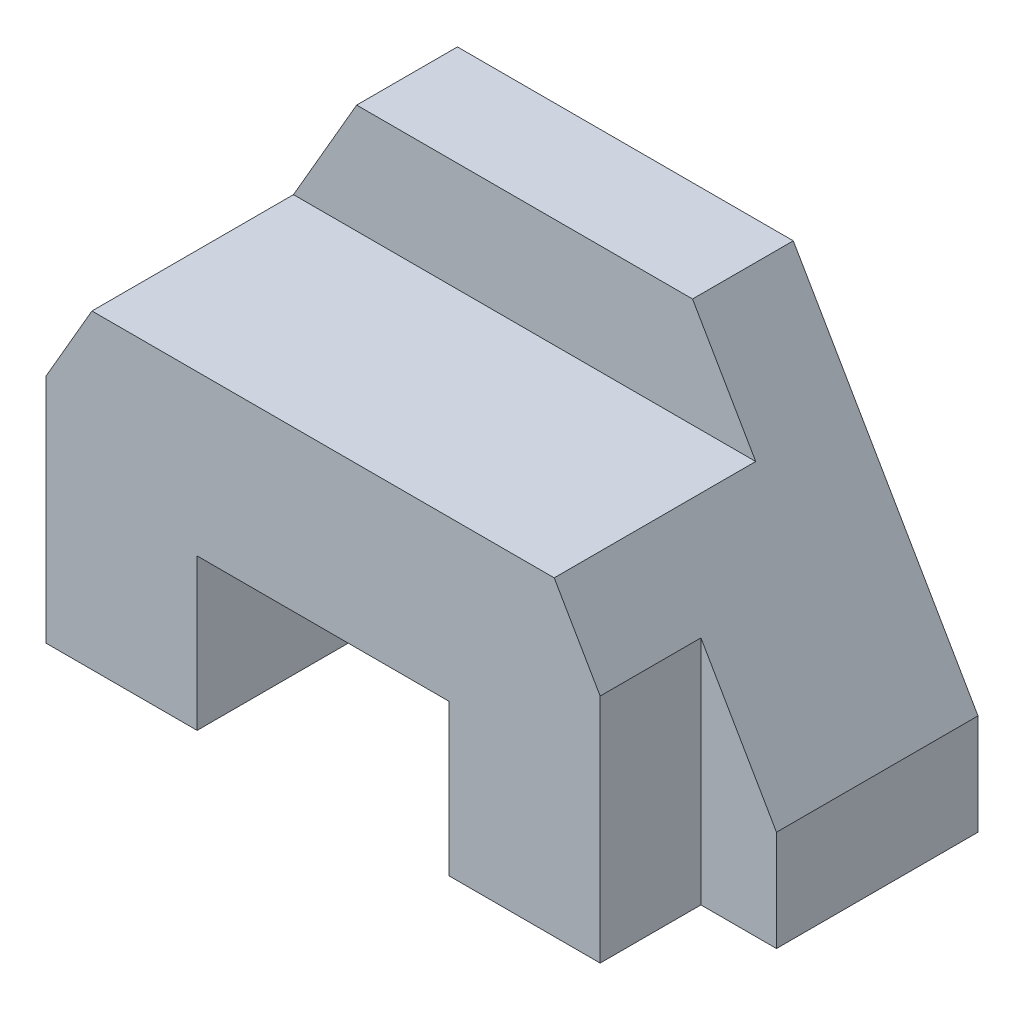
ISO-10303-21;
HEADER;
FILE_DESCRIPTION(('STEP AP214'),'2;1');
FILE_NAME('part.step','',(''),(''),'','','');
FILE_SCHEMA(('AUTOMOTIVE_DESIGN { 1 0 10303 214 1 1 1 1 }'));
ENDSEC;
DATA;
#1=APPLICATION_CONTEXT('core data for automotive mechanical design processes');
#2=APPLICATION_PROTOCOL_DEFINITION('international standard','automotive_design',2000,#1);
#3=PRODUCT_CONTEXT('',#1,'mechanical');
#4=PRODUCT('Part','Part','',(#3));
#5=PRODUCT_RELATED_PRODUCT_CATEGORY('part','',(#4));
#6=PRODUCT_DEFINITION_FORMATION('','',#4);
#7=PRODUCT_DEFINITION_CONTEXT('part definition',#1,'design');
#8=PRODUCT_DEFINITION('design','',#6,#7);
#9=PRODUCT_DEFINITION_SHAPE('','',#8);
#10=(LENGTH_UNIT() NAMED_UNIT(*) SI_UNIT(.MILLI.,.METRE.));
#11=(NAMED_UNIT(*) PLANE_ANGLE_UNIT() SI_UNIT($,.RADIAN.));
#12=(NAMED_UNIT(*) SI_UNIT($,.STERADIAN.) SOLID_ANGLE_UNIT());
#13=UNCERTAINTY_MEASURE_WITH_UNIT(LENGTH_MEASURE(1.E-05),#10,'distance_accuracy_value','');
#14=(GEOMETRIC_REPRESENTATION_CONTEXT(3) GLOBAL_UNCERTAINTY_ASSIGNED_CONTEXT((#13)) GLOBAL_UNIT_ASSIGNED_CONTEXT((#10,
#11,#12)) REPRESENTATION_CONTEXT('',''));
#15=CARTESIAN_POINT('',(0.,0.,0.));
#16=DIRECTION('',(0.,0.,1.));
#17=DIRECTION('',(1.,0.,0.));
#18=AXIS2_PLACEMENT_3D('',#15,#16,#17);
#19=CARTESIAN_POINT('',(-1066.8,0.,-914.4));
#20=DIRECTION('',(0.,-1.,0.));
#21=DIRECTION('',(0.,0.,-1.));
#22=AXIS2_PLACEMENT_3D('',#19,#20,#21);
#23=PLANE('',#22);
#24=DIRECTION('',(1.,0.,0.));
#25=VECTOR('',#24,1.);
#26=CARTESIAN_POINT('',(-1066.8,0.,0.));
#27=LINE('',#26,#25);
#28=CARTESIAN_POINT('',(-838.2,0.,0.));
#29=VERTEX_POINT('',#28);
#30=CARTESIAN_POINT('',(-381.,0.,0.));
#31=VERTEX_POINT('',#30);
#32=EDGE_CURVE('E244',#29,#31,#27,.T.);
#33=ORIENTED_EDGE('',*,*,#32,.F.);
#34=DIRECTION('',(0.,0.,-1.));
#35=VECTOR('',#34,1.);
#36=CARTESIAN_POINT('',(-838.2,0.,-304.8));
#37=LINE('',#36,#35);
#38=CARTESIAN_POINT('',(-838.2,0.,-304.8));
#39=VERTEX_POINT('',#38);
#40=EDGE_CURVE('E226',#29,#39,#37,.T.);
#41=ORIENTED_EDGE('',*,*,#40,.T.);
#42=DIRECTION('',(-1.,0.,0.));
#43=VECTOR('',#42,1.);
#44=CARTESIAN_POINT('',(-1066.8,0.,-304.8));
#45=LINE('',#44,#43);
#46=CARTESIAN_POINT('',(-1066.8,0.,-304.8));
#47=VERTEX_POINT('',#46);
#48=EDGE_CURVE('E223',#39,#47,#45,.T.);
#49=ORIENTED_EDGE('',*,*,#48,.T.);
#50=DIRECTION('',(0.,0.,1.));
#51=VECTOR('',#50,1.);
#52=CARTESIAN_POINT('',(-1066.8,0.,-914.4));
#53=LINE('',#52,#51);
#54=CARTESIAN_POINT('',(-1066.8,0.,-914.4));
#55=VERTEX_POINT('',#54);
#56=EDGE_CURVE('E180',#55,#47,#53,.T.);
#57=ORIENTED_EDGE('',*,*,#56,.F.);
#58=DIRECTION('',(1.,0.,0.));
#59=VECTOR('',#58,1.);
#60=CARTESIAN_POINT('',(-1066.8,0.,-914.4));
#61=LINE('',#60,#59);
#62=CARTESIAN_POINT('',(-381.,0.,-914.4));
#63=VERTEX_POINT('',#62);
#64=EDGE_CURVE('E171',#55,#63,#61,.T.);
#65=ORIENTED_EDGE('',*,*,#64,.T.);
#66=DIRECTION('',(0.,0.,1.));
#67=VECTOR('',#66,1.);
#68=CARTESIAN_POINT('',(-381.,0.,-914.4));
#69=LINE('',#68,#67);
#70=EDGE_CURVE('E205',#63,#31,#69,.T.);
#71=ORIENTED_EDGE('',*,*,#70,.T.);
#72=EDGE_LOOP('',(#33,#41,#49,#57,#65,#71));
#73=FACE_BOUND('',#72,.T.);
#74=ADVANCED_FACE('F33',(#73),#23,.T.);
#75=CARTESIAN_POINT('',(-1066.8,304.8,-914.4));
#76=DIRECTION('',(-1.,0.,0.));
#77=DIRECTION('',(0.,-1.,0.));
#78=AXIS2_PLACEMENT_3D('',#75,#76,#77);
#79=PLANE('',#78);
#80=ORIENTED_EDGE('',*,*,#56,.T.);
#81=DIRECTION('',(0.,-1.,0.));
#82=VECTOR('',#81,1.);
#83=CARTESIAN_POINT('',(-1066.8,1270.,-304.8));
#84=LINE('',#83,#82);
#85=CARTESIAN_POINT('',(-1066.8,304.8,-304.8));
#86=VERTEX_POINT('',#85);
#87=EDGE_CURVE('E217',#86,#47,#84,.T.);
#88=ORIENTED_EDGE('',*,*,#87,.F.);
#89=DIRECTION('',(0.,0.,1.));
#90=VECTOR('',#89,1.);
#91=CARTESIAN_POINT('',(-1066.8,304.8,-914.4));
#92=LINE('',#91,#90);
#93=CARTESIAN_POINT('',(-1066.8,304.8,-914.4));
#94=VERTEX_POINT('',#93);
#95=EDGE_CURVE('E184',#94,#86,#92,.T.);
#96=ORIENTED_EDGE('',*,*,#95,.F.);
#97=DIRECTION('',(0.,-1.,0.));
#98=VECTOR('',#97,1.);
#99=CARTESIAN_POINT('',(-1066.8,304.8,-914.4));
#100=LINE('',#99,#98);
#101=EDGE_CURVE('E208',#94,#55,#100,.T.);
#102=ORIENTED_EDGE('',*,*,#101,.T.);
#103=EDGE_LOOP('',(#80,#88,#96,#102));
#104=FACE_BOUND('',#103,.T.);
#105=ADVANCED_FACE('F221',(#104),#79,.T.);
#106=CARTESIAN_POINT('',(-508.,1270.,-914.4));
#107=DIRECTION('',(-0.865426285481126,0.501036270541705,0.));
#108=DIRECTION('',(-0.501036270541705,-0.865426285481126,0.));
#109=AXIS2_PLACEMENT_3D('',#106,#107,#108);
#110=PLANE('',#109);
#111=DIRECTION('',(-0.501036270541705,-0.865426285481126,0.));
#112=VECTOR('',#111,1.);
#113=CARTESIAN_POINT('',(-508.,1270.,-609.6));
#114=LINE('',#113,#112);
#115=CARTESIAN_POINT('',(-508.,1270.,-609.6));
#116=VERTEX_POINT('',#115);
#117=CARTESIAN_POINT('',(-699.168421052632,939.8,-609.6));
#118=VERTEX_POINT('',#117);
#119=EDGE_CURVE('E289',#116,#118,#114,.T.);
#120=ORIENTED_EDGE('',*,*,#119,.F.);
#121=DIRECTION('',(0.,0.,1.));
#122=VECTOR('',#121,1.);
#123=CARTESIAN_POINT('',(-508.,1270.,-914.4));
#124=LINE('',#123,#122);
#125=CARTESIAN_POINT('',(-508.,1270.,-914.4));
#126=VERTEX_POINT('',#125);
#127=EDGE_CURVE('E187',#126,#116,#124,.T.);
#128=ORIENTED_EDGE('',*,*,#127,.F.);
#129=DIRECTION('',(-0.501036270541705,-0.865426285481126,0.));
#130=VECTOR('',#129,1.);
#131=CARTESIAN_POINT('',(-508.,1270.,-914.4));
#132=LINE('',#131,#130);
#133=EDGE_CURVE('E266',#126,#94,#132,.T.);
#134=ORIENTED_EDGE('',*,*,#133,.T.);
#135=ORIENTED_EDGE('',*,*,#95,.T.);
#136=DIRECTION('',(0.501036270541705,0.865426285481126,0.));
#137=VECTOR('',#136,1.);
#138=CARTESIAN_POINT('',(-508.,1270.,-304.8));
#139=LINE('',#138,#137);
#140=CARTESIAN_POINT('',(-838.2,699.654545454546,-304.8));
#141=VERTEX_POINT('',#140);
#142=EDGE_CURVE('E40',#86,#141,#139,.T.);
#143=ORIENTED_EDGE('',*,*,#142,.T.);
#144=DIRECTION('',(0.,0.,1.));
#145=VECTOR('',#144,1.);
#146=CARTESIAN_POINT('',(-838.2,699.654545454546,-914.4));
#147=LINE('',#146,#145);
#148=CARTESIAN_POINT('',(-838.2,699.654545454546,0.));
#149=VERTEX_POINT('',#148);
#150=EDGE_CURVE('E170',#141,#149,#147,.T.);
#151=ORIENTED_EDGE('',*,*,#150,.T.);
#152=DIRECTION('',(-0.501036270541705,-0.865426285481126,0.));
#153=VECTOR('',#152,1.);
#154=CARTESIAN_POINT('',(-508.,1270.,0.));
#155=LINE('',#154,#153);
#156=CARTESIAN_POINT('',(-699.168421052632,939.8,0.));
#157=VERTEX_POINT('',#156);
#158=EDGE_CURVE('E162',#157,#149,#155,.T.);
#159=ORIENTED_EDGE('',*,*,#158,.F.);
#160=DIRECTION('',(0.,0.,1.));
#161=VECTOR('',#160,1.);
#162=CARTESIAN_POINT('',(-699.168421052632,939.8,-914.4));
#163=LINE('',#162,#161);
#164=EDGE_CURVE('E146',#118,#157,#163,.T.);
#165=ORIENTED_EDGE('',*,*,#164,.F.);
#166=EDGE_LOOP('',(#120,#128,#134,#135,#143,#151,#159,#165));
#167=FACE_BOUND('',#166,.T.);
#168=ADVANCED_FACE('F168',(#167),#110,.T.);
#169=CARTESIAN_POINT('',(1066.8,304.8,-914.4));
#170=DIRECTION('',(0.865426285481126,0.501036270541705,0.));
#171=DIRECTION('',(-0.501036270541705,0.865426285481126,0.));
#172=AXIS2_PLACEMENT_3D('',#169,#170,#171);
#173=PLANE('',#172);
#174=DIRECTION('',(-0.501036270541705,0.865426285481126,0.));
#175=VECTOR('',#174,1.);
#176=CARTESIAN_POINT('',(1066.8,304.8,-609.6));
#177=LINE('',#176,#175);
#178=CARTESIAN_POINT('',(699.168421052632,939.8,-609.6));
#179=VERTEX_POINT('',#178);
#180=CARTESIAN_POINT('',(508.,1270.,-609.6));
#181=VERTEX_POINT('',#180);
#182=EDGE_CURVE('E46',#179,#181,#177,.T.);
#183=ORIENTED_EDGE('',*,*,#182,.F.);
#184=DIRECTION('',(0.,0.,-1.));
#185=VECTOR('',#184,1.);
#186=CARTESIAN_POINT('',(699.168421052632,939.8,-914.4));
#187=LINE('',#186,#185);
#188=CARTESIAN_POINT('',(699.168421052632,939.8,0.));
#189=VERTEX_POINT('',#188);
#190=EDGE_CURVE('E156',#189,#179,#187,.T.);
#191=ORIENTED_EDGE('',*,*,#190,.F.);
#192=DIRECTION('',(-0.501036270541705,0.865426285481126,0.));
#193=VECTOR('',#192,1.);
#194=CARTESIAN_POINT('',(1066.8,304.8,0.));
#195=LINE('',#194,#193);
#196=CARTESIAN_POINT('',(838.2,699.654545454546,0.));
#197=VERTEX_POINT('',#196);
#198=EDGE_CURVE('E165',#197,#189,#195,.T.);
#199=ORIENTED_EDGE('',*,*,#198,.F.);
#200=DIRECTION('',(0.,0.,-1.));
#201=VECTOR('',#200,1.);
#202=CARTESIAN_POINT('',(838.2,699.654545454546,-914.4));
#203=LINE('',#202,#201);
#204=CARTESIAN_POINT('',(838.2,699.654545454546,-304.8));
#205=VERTEX_POINT('',#204);
#206=EDGE_CURVE('E54',#197,#205,#203,.T.);
#207=ORIENTED_EDGE('',*,*,#206,.T.);
#208=DIRECTION('',(0.501036270541705,-0.865426285481126,0.));
#209=VECTOR('',#208,1.);
#210=CARTESIAN_POINT('',(1066.8,304.8,-304.8));
#211=LINE('',#210,#209);
#212=CARTESIAN_POINT('',(1066.8,304.8,-304.8));
#213=VERTEX_POINT('',#212);
#214=EDGE_CURVE('E242',#205,#213,#211,.T.);
#215=ORIENTED_EDGE('',*,*,#214,.T.);
#216=DIRECTION('',(0.,0.,1.));
#217=VECTOR('',#216,1.);
#218=CARTESIAN_POINT('',(1066.8,304.8,-914.4));
#219=LINE('',#218,#217);
#220=CARTESIAN_POINT('',(1066.8,304.8,-914.4));
#221=VERTEX_POINT('',#220);
#222=EDGE_CURVE('E193',#221,#213,#219,.T.);
#223=ORIENTED_EDGE('',*,*,#222,.F.);
#224=DIRECTION('',(-0.501036270541705,0.865426285481126,0.));
#225=VECTOR('',#224,1.);
#226=CARTESIAN_POINT('',(1066.8,304.8,-914.4));
#227=LINE('',#226,#225);
#228=CARTESIAN_POINT('',(508.,1270.,-914.4));
#229=VERTEX_POINT('',#228);
#230=EDGE_CURVE('E260',#221,#229,#227,.T.);
#231=ORIENTED_EDGE('',*,*,#230,.T.);
#232=DIRECTION('',(0.,0.,1.));
#233=VECTOR('',#232,1.);
#234=CARTESIAN_POINT('',(508.,1270.,-914.4));
#235=LINE('',#234,#233);
#236=EDGE_CURVE('E190',#229,#181,#235,.T.);
#237=ORIENTED_EDGE('',*,*,#236,.T.);
#238=EDGE_LOOP('',(#183,#191,#199,#207,#215,#223,#231,#237));
#239=FACE_BOUND('',#238,.T.);
#240=ADVANCED_FACE('F288',(#239),#173,.T.);
#241=CARTESIAN_POINT('',(1066.8,0.,-914.4));
#242=DIRECTION('',(1.,0.,0.));
#243=DIRECTION('',(0.,1.,0.));
#244=AXIS2_PLACEMENT_3D('',#241,#242,#243);
#245=PLANE('',#244);
#246=ORIENTED_EDGE('',*,*,#222,.T.);
#247=DIRECTION('',(0.,-1.,0.));
#248=VECTOR('',#247,1.);
#249=CARTESIAN_POINT('',(1066.8,1270.,-304.8));
#250=LINE('',#249,#248);
#251=CARTESIAN_POINT('',(1066.8,0.,-304.8));
#252=VERTEX_POINT('',#251);
#253=EDGE_CURVE('E237',#213,#252,#250,.T.);
#254=ORIENTED_EDGE('',*,*,#253,.T.);
#255=DIRECTION('',(0.,0.,1.));
#256=VECTOR('',#255,1.);
#257=CARTESIAN_POINT('',(1066.8,0.,-914.4));
#258=LINE('',#257,#256);
#259=CARTESIAN_POINT('',(1066.8,0.,-914.4));
#260=VERTEX_POINT('',#259);
#261=EDGE_CURVE('E196',#260,#252,#258,.T.);
#262=ORIENTED_EDGE('',*,*,#261,.F.);
#263=DIRECTION('',(0.,1.,0.));
#264=VECTOR('',#263,1.);
#265=CARTESIAN_POINT('',(1066.8,0.,-914.4));
#266=LINE('',#265,#264);
#267=EDGE_CURVE('E257',#260,#221,#266,.T.);
#268=ORIENTED_EDGE('',*,*,#267,.T.);
#269=EDGE_LOOP('',(#246,#254,#262,#268));
#270=FACE_BOUND('',#269,.T.);
#271=ADVANCED_FACE('F315',(#270),#245,.T.);
#272=CARTESIAN_POINT('',(381.,0.,-914.4));
#273=DIRECTION('',(0.,-1.,0.));
#274=DIRECTION('',(0.,0.,-1.));
#275=AXIS2_PLACEMENT_3D('',#272,#273,#274);
#276=PLANE('',#275);
#277=ORIENTED_EDGE('',*,*,#261,.T.);
#278=DIRECTION('',(-1.,0.,0.));
#279=VECTOR('',#278,1.);
#280=CARTESIAN_POINT('',(1066.8,0.,-304.8));
#281=LINE('',#280,#279);
#282=CARTESIAN_POINT('',(838.2,0.,-304.8));
#283=VERTEX_POINT('',#282);
#284=EDGE_CURVE('E155',#252,#283,#281,.T.);
#285=ORIENTED_EDGE('',*,*,#284,.T.);
#286=DIRECTION('',(0.,0.,1.));
#287=VECTOR('',#286,1.);
#288=CARTESIAN_POINT('',(838.2,0.,-304.8));
#289=LINE('',#288,#287);
#290=CARTESIAN_POINT('',(838.2,0.,0.));
#291=VERTEX_POINT('',#290);
#292=EDGE_CURVE('E232',#283,#291,#289,.T.);
#293=ORIENTED_EDGE('',*,*,#292,.T.);
#294=DIRECTION('',(1.,0.,0.));
#295=VECTOR('',#294,1.);
#296=CARTESIAN_POINT('',(381.,0.,0.));
#297=LINE('',#296,#295);
#298=CARTESIAN_POINT('',(381.,0.,0.));
#299=VERTEX_POINT('',#298);
#300=EDGE_CURVE('E176',#299,#291,#297,.T.);
#301=ORIENTED_EDGE('',*,*,#300,.F.);
#302=DIRECTION('',(0.,0.,1.));
#303=VECTOR('',#302,1.);
#304=CARTESIAN_POINT('',(381.,0.,-914.4));
#305=LINE('',#304,#303);
#306=CARTESIAN_POINT('',(381.,0.,-914.4));
#307=VERTEX_POINT('',#306);
#308=EDGE_CURVE('E199',#307,#299,#305,.T.);
#309=ORIENTED_EDGE('',*,*,#308,.F.);
#310=DIRECTION('',(1.,0.,0.));
#311=VECTOR('',#310,1.);
#312=CARTESIAN_POINT('',(381.,0.,-914.4));
#313=LINE('',#312,#311);
#314=EDGE_CURVE('E254',#307,#260,#313,.T.);
#315=ORIENTED_EDGE('',*,*,#314,.T.);
#316=EDGE_LOOP('',(#277,#285,#293,#301,#309,#315));
#317=FACE_BOUND('',#316,.T.);
#318=ADVANCED_FACE('F282',(#317),#276,.T.);
#319=CARTESIAN_POINT('',(0.,0.,0.));
#320=DIRECTION('',(0.,0.,1.));
#321=DIRECTION('',(1.,0.,0.));
#322=AXIS2_PLACEMENT_3D('',#319,#320,#321);
#323=PLANE('',#322);
#324=DIRECTION('',(1.,0.,0.));
#325=VECTOR('',#324,1.);
#326=CARTESIAN_POINT('',(-1066.8,939.8,0.));
#327=LINE('',#326,#325);
#328=EDGE_CURVE('E149',#157,#189,#327,.T.);
#329=ORIENTED_EDGE('',*,*,#328,.F.);
#330=ORIENTED_EDGE('',*,*,#158,.T.);
#331=DIRECTION('',(0.,-1.,0.));
#332=VECTOR('',#331,1.);
#333=CARTESIAN_POINT('',(-838.2,0.,0.));
#334=LINE('',#333,#332);
#335=EDGE_CURVE('E210',#149,#29,#334,.T.);
#336=ORIENTED_EDGE('',*,*,#335,.T.);
#337=ORIENTED_EDGE('',*,*,#32,.T.);
#338=DIRECTION('',(0.,1.,0.));
#339=VECTOR('',#338,1.);
#340=CARTESIAN_POINT('',(-381.,0.,0.));
#341=LINE('',#340,#339);
#342=CARTESIAN_POINT('',(-381.,457.2,0.));
#343=VERTEX_POINT('',#342);
#344=EDGE_CURVE('E270',#31,#343,#341,.T.);
#345=ORIENTED_EDGE('',*,*,#344,.T.);
#346=DIRECTION('',(1.,0.,0.));
#347=VECTOR('',#346,1.);
#348=CARTESIAN_POINT('',(-381.,457.2,0.));
#349=LINE('',#348,#347);
#350=CARTESIAN_POINT('',(381.,457.2,0.));
#351=VERTEX_POINT('',#350);
#352=EDGE_CURVE('E273',#343,#351,#349,.T.);
#353=ORIENTED_EDGE('',*,*,#352,.T.);
#354=DIRECTION('',(0.,-1.,0.));
#355=VECTOR('',#354,1.);
#356=CARTESIAN_POINT('',(381.,457.2,0.));
#357=LINE('',#356,#355);
#358=EDGE_CURVE('E276',#351,#299,#357,.T.);
#359=ORIENTED_EDGE('',*,*,#358,.T.);
#360=ORIENTED_EDGE('',*,*,#300,.T.);
#361=DIRECTION('',(0.,1.,0.));
#362=VECTOR('',#361,1.);
#363=CARTESIAN_POINT('',(838.2,0.,0.));
#364=LINE('',#363,#362);
#365=EDGE_CURVE('E183',#291,#197,#364,.T.);
#366=ORIENTED_EDGE('',*,*,#365,.T.);
#367=ORIENTED_EDGE('',*,*,#198,.T.);
#368=EDGE_LOOP('',(#329,#330,#336,#337,#345,#353,#359,#360,#366,#367));
#369=FACE_BOUND('',#368,.T.);
#370=ADVANCED_FACE('F160',(#369),#323,.T.);
#371=CARTESIAN_POINT('',(508.,1270.,-914.4));
#372=DIRECTION('',(0.,1.,0.));
#373=DIRECTION('',(0.,0.,1.));
#374=AXIS2_PLACEMENT_3D('',#371,#372,#373);
#375=PLANE('',#374);
#376=DIRECTION('',(-1.,0.,0.));
#377=VECTOR('',#376,1.);
#378=CARTESIAN_POINT('',(508.,1270.,-609.6));
#379=LINE('',#378,#377);
#380=EDGE_CURVE('E11',#181,#116,#379,.T.);
#381=ORIENTED_EDGE('',*,*,#380,.F.);
#382=ORIENTED_EDGE('',*,*,#236,.F.);
#383=DIRECTION('',(-1.,0.,0.));
#384=VECTOR('',#383,1.);
#385=CARTESIAN_POINT('',(508.,1270.,-914.4));
#386=LINE('',#385,#384);
#387=EDGE_CURVE('E263',#229,#126,#386,.T.);
#388=ORIENTED_EDGE('',*,*,#387,.T.);
#389=ORIENTED_EDGE('',*,*,#127,.T.);
#390=EDGE_LOOP('',(#381,#382,#388,#389));
#391=FACE_BOUND('',#390,.T.);
#392=ADVANCED_FACE('F336',(#391),#375,.T.);
#393=CARTESIAN_POINT('',(381.,457.2,-914.4));
#394=DIRECTION('',(-1.,0.,0.));
#395=DIRECTION('',(0.,-1.,0.));
#396=AXIS2_PLACEMENT_3D('',#393,#394,#395);
#397=PLANE('',#396);
#398=ORIENTED_EDGE('',*,*,#358,.F.);
#399=DIRECTION('',(0.,0.,1.));
#400=VECTOR('',#399,1.);
#401=CARTESIAN_POINT('',(381.,457.2,-914.4));
#402=LINE('',#401,#400);
#403=CARTESIAN_POINT('',(381.,457.2,-914.4));
#404=VERTEX_POINT('',#403);
#405=EDGE_CURVE('E201',#404,#351,#402,.T.);
#406=ORIENTED_EDGE('',*,*,#405,.F.);
#407=DIRECTION('',(0.,-1.,0.));
#408=VECTOR('',#407,1.);
#409=CARTESIAN_POINT('',(381.,457.2,-914.4));
#410=LINE('',#409,#408);
#411=EDGE_CURVE('E251',#404,#307,#410,.T.);
#412=ORIENTED_EDGE('',*,*,#411,.T.);
#413=ORIENTED_EDGE('',*,*,#308,.T.);
#414=EDGE_LOOP('',(#398,#406,#412,#413));
#415=FACE_BOUND('',#414,.T.);
#416=ADVANCED_FACE('F309',(#415),#397,.T.);
#417=CARTESIAN_POINT('',(-381.,457.2,-914.4));
#418=DIRECTION('',(0.,-1.,0.));
#419=DIRECTION('',(0.,0.,-1.));
#420=AXIS2_PLACEMENT_3D('',#417,#418,#419);
#421=PLANE('',#420);
#422=ORIENTED_EDGE('',*,*,#352,.F.);
#423=DIRECTION('',(0.,0.,1.));
#424=VECTOR('',#423,1.);
#425=CARTESIAN_POINT('',(-381.,457.2,-914.4));
#426=LINE('',#425,#424);
#427=CARTESIAN_POINT('',(-381.,457.2,-914.4));
#428=VERTEX_POINT('',#427);
#429=EDGE_CURVE('E203',#428,#343,#426,.T.);
#430=ORIENTED_EDGE('',*,*,#429,.F.);
#431=DIRECTION('',(1.,0.,0.));
#432=VECTOR('',#431,1.);
#433=CARTESIAN_POINT('',(-381.,457.2,-914.4));
#434=LINE('',#433,#432);
#435=EDGE_CURVE('E248',#428,#404,#434,.T.);
#436=ORIENTED_EDGE('',*,*,#435,.T.);
#437=ORIENTED_EDGE('',*,*,#405,.T.);
#438=EDGE_LOOP('',(#422,#430,#436,#437));
#439=FACE_BOUND('',#438,.T.);
#440=ADVANCED_FACE('F306',(#439),#421,.T.);
#441=CARTESIAN_POINT('',(-381.,0.,-914.4));
#442=DIRECTION('',(1.,0.,0.));
#443=DIRECTION('',(0.,1.,0.));
#444=AXIS2_PLACEMENT_3D('',#441,#442,#443);
#445=PLANE('',#444);
#446=ORIENTED_EDGE('',*,*,#344,.F.);
#447=ORIENTED_EDGE('',*,*,#70,.F.);
#448=DIRECTION('',(0.,1.,0.));
#449=VECTOR('',#448,1.);
#450=CARTESIAN_POINT('',(-381.,0.,-914.4));
#451=LINE('',#450,#449);
#452=EDGE_CURVE('E174',#63,#428,#451,.T.);
#453=ORIENTED_EDGE('',*,*,#452,.T.);
#454=ORIENTED_EDGE('',*,*,#429,.T.);
#455=EDGE_LOOP('',(#446,#447,#453,#454));
#456=FACE_BOUND('',#455,.T.);
#457=ADVANCED_FACE('F302',(#456),#445,.T.);
#458=CARTESIAN_POINT('',(0.,0.,-914.4));
#459=DIRECTION('',(0.,0.,1.));
#460=DIRECTION('',(1.,0.,0.));
#461=AXIS2_PLACEMENT_3D('',#458,#459,#460);
#462=PLANE('',#461);
#463=ORIENTED_EDGE('',*,*,#64,.F.);
#464=ORIENTED_EDGE('',*,*,#101,.F.);
#465=ORIENTED_EDGE('',*,*,#133,.F.);
#466=ORIENTED_EDGE('',*,*,#387,.F.);
#467=ORIENTED_EDGE('',*,*,#230,.F.);
#468=ORIENTED_EDGE('',*,*,#267,.F.);
#469=ORIENTED_EDGE('',*,*,#314,.F.);
#470=ORIENTED_EDGE('',*,*,#411,.F.);
#471=ORIENTED_EDGE('',*,*,#435,.F.);
#472=ORIENTED_EDGE('',*,*,#452,.F.);
#473=EDGE_LOOP('',(#463,#464,#465,#466,#467,#468,#469,#470,#471,#472));
#474=FACE_BOUND('',#473,.T.);
#475=ADVANCED_FACE('F311',(#474),#462,.F.);
#476=CARTESIAN_POINT('',(1066.8,1270.,-304.8));
#477=DIRECTION('',(0.,0.,1.));
#478=DIRECTION('',(1.,0.,0.));
#479=AXIS2_PLACEMENT_3D('',#476,#477,#478);
#480=PLANE('',#479);
#481=DIRECTION('',(0.,-1.,0.));
#482=VECTOR('',#481,1.);
#483=CARTESIAN_POINT('',(838.2,1270.,-304.8));
#484=LINE('',#483,#482);
#485=EDGE_CURVE('E235',#205,#283,#484,.T.);
#486=ORIENTED_EDGE('',*,*,#485,.T.);
#487=ORIENTED_EDGE('',*,*,#284,.F.);
#488=ORIENTED_EDGE('',*,*,#253,.F.);
#489=ORIENTED_EDGE('',*,*,#214,.F.);
#490=EDGE_LOOP('',(#486,#487,#488,#489));
#491=FACE_BOUND('',#490,.T.);
#492=ADVANCED_FACE('F316',(#491),#480,.T.);
#493=CARTESIAN_POINT('',(838.2,1270.,-304.8));
#494=DIRECTION('',(1.,0.,0.));
#495=DIRECTION('',(0.,0.,-1.));
#496=AXIS2_PLACEMENT_3D('',#493,#494,#495);
#497=PLANE('',#496);
#498=ORIENTED_EDGE('',*,*,#365,.F.);
#499=ORIENTED_EDGE('',*,*,#292,.F.);
#500=ORIENTED_EDGE('',*,*,#485,.F.);
#501=ORIENTED_EDGE('',*,*,#206,.F.);
#502=EDGE_LOOP('',(#498,#499,#500,#501));
#503=FACE_BOUND('',#502,.T.);
#504=ADVANCED_FACE('F285',(#503),#497,.T.);
#505=CARTESIAN_POINT('',(-838.2,1270.,-304.8));
#506=DIRECTION('',(-1.,0.,0.));
#507=DIRECTION('',(0.,0.,1.));
#508=AXIS2_PLACEMENT_3D('',#505,#506,#507);
#509=PLANE('',#508);
#510=DIRECTION('',(0.,-1.,0.));
#511=VECTOR('',#510,1.);
#512=CARTESIAN_POINT('',(-838.2,1270.,-304.8));
#513=LINE('',#512,#511);
#514=EDGE_CURVE('E219',#141,#39,#513,.T.);
#515=ORIENTED_EDGE('',*,*,#514,.T.);
#516=ORIENTED_EDGE('',*,*,#40,.F.);
#517=ORIENTED_EDGE('',*,*,#335,.F.);
#518=ORIENTED_EDGE('',*,*,#150,.F.);
#519=EDGE_LOOP('',(#515,#516,#517,#518));
#520=FACE_BOUND('',#519,.T.);
#521=ADVANCED_FACE('F297',(#520),#509,.T.);
#522=CARTESIAN_POINT('',(-1066.8,1270.,-304.8));
#523=DIRECTION('',(0.,0.,1.));
#524=DIRECTION('',(1.,0.,0.));
#525=AXIS2_PLACEMENT_3D('',#522,#523,#524);
#526=PLANE('',#525);
#527=ORIENTED_EDGE('',*,*,#87,.T.);
#528=ORIENTED_EDGE('',*,*,#48,.F.);
#529=ORIENTED_EDGE('',*,*,#514,.F.);
#530=ORIENTED_EDGE('',*,*,#142,.F.);
#531=EDGE_LOOP('',(#527,#528,#529,#530));
#532=FACE_BOUND('',#531,.T.);
#533=ADVANCED_FACE('F215',(#532),#526,.T.);
#534=CARTESIAN_POINT('',(-1066.8,1270.,-609.6));
#535=DIRECTION('',(0.,0.,-1.));
#536=DIRECTION('',(-1.,0.,0.));
#537=AXIS2_PLACEMENT_3D('',#534,#535,#536);
#538=PLANE('',#537);
#539=ORIENTED_EDGE('',*,*,#119,.T.);
#540=DIRECTION('',(1.,0.,0.));
#541=VECTOR('',#540,1.);
#542=CARTESIAN_POINT('',(-1066.8,939.8,-609.6));
#543=LINE('',#542,#541);
#544=EDGE_CURVE('E151',#118,#179,#543,.T.);
#545=ORIENTED_EDGE('',*,*,#544,.T.);
#546=ORIENTED_EDGE('',*,*,#182,.T.);
#547=ORIENTED_EDGE('',*,*,#380,.T.);
#548=EDGE_LOOP('',(#539,#545,#546,#547));
#549=FACE_BOUND('',#548,.T.);
#550=ADVANCED_FACE('F409',(#549),#538,.F.);
#551=CARTESIAN_POINT('',(-1066.8,939.8,-609.6));
#552=DIRECTION('',(0.,-1.,0.));
#553=DIRECTION('',(0.,0.,-1.));
#554=AXIS2_PLACEMENT_3D('',#551,#552,#553);
#555=PLANE('',#554);
#556=ORIENTED_EDGE('',*,*,#164,.T.);
#557=ORIENTED_EDGE('',*,*,#328,.T.);
#558=ORIENTED_EDGE('',*,*,#190,.T.);
#559=ORIENTED_EDGE('',*,*,#544,.F.);
#560=EDGE_LOOP('',(#556,#557,#558,#559));
#561=FACE_BOUND('',#560,.T.);
#562=ADVANCED_FACE('F148',(#561),#555,.F.);
#563=CLOSED_SHELL('',(#74,#105,#168,#240,#271,#318,#370,#392,#416,#440,#457,#475,#492,#504,#521,
#533,#550,#562));
#564=MANIFOLD_SOLID_BREP('B2',#563);
#565=ADVANCED_BREP_SHAPE_REPRESENTATION('',(#18,#564),#14);
#566=SHAPE_DEFINITION_REPRESENTATION(#9,#565);
ENDSEC;
END-ISO-10303-21;
